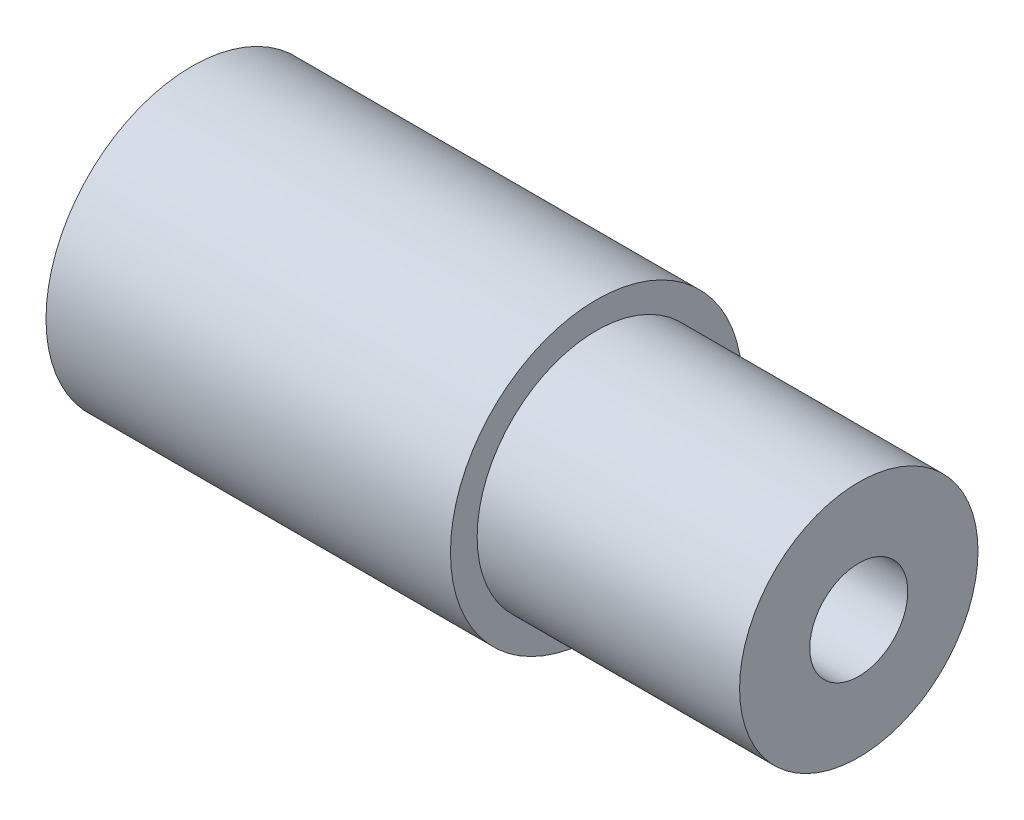
ISO-10303-21;
HEADER;
FILE_DESCRIPTION(('STEP AP214'),'2;1');
FILE_NAME('part.step','',(''),(''),'','','');
FILE_SCHEMA(('AUTOMOTIVE_DESIGN { 1 0 10303 214 1 1 1 1 }'));
ENDSEC;
DATA;
#1=APPLICATION_CONTEXT('core data for automotive mechanical design processes');
#2=APPLICATION_PROTOCOL_DEFINITION('international standard','automotive_design',2000,#1);
#3=PRODUCT_CONTEXT('',#1,'mechanical');
#4=PRODUCT('Part','Part','',(#3));
#5=PRODUCT_RELATED_PRODUCT_CATEGORY('part','',(#4));
#6=PRODUCT_DEFINITION_FORMATION('','',#4);
#7=PRODUCT_DEFINITION_CONTEXT('part definition',#1,'design');
#8=PRODUCT_DEFINITION('design','',#6,#7);
#9=PRODUCT_DEFINITION_SHAPE('','',#8);
#10=(LENGTH_UNIT() NAMED_UNIT(*) SI_UNIT(.MILLI.,.METRE.));
#11=(NAMED_UNIT(*) PLANE_ANGLE_UNIT() SI_UNIT($,.RADIAN.));
#12=(NAMED_UNIT(*) SI_UNIT($,.STERADIAN.) SOLID_ANGLE_UNIT());
#13=UNCERTAINTY_MEASURE_WITH_UNIT(LENGTH_MEASURE(1.E-05),#10,'distance_accuracy_value','');
#14=(GEOMETRIC_REPRESENTATION_CONTEXT(3) GLOBAL_UNCERTAINTY_ASSIGNED_CONTEXT((#13)) GLOBAL_UNIT_ASSIGNED_CONTEXT((#10,
#11,#12)) REPRESENTATION_CONTEXT('',''));
#15=CARTESIAN_POINT('',(0.,0.,0.));
#16=DIRECTION('',(0.,0.,1.));
#17=DIRECTION('',(1.,0.,0.));
#18=AXIS2_PLACEMENT_3D('',#15,#16,#17);
#19=CARTESIAN_POINT('',(-21.6,0.,0.));
#20=DIRECTION('',(1.,0.,0.));
#21=DIRECTION('',(0.,0.,-1.));
#22=AXIS2_PLACEMENT_3D('',#19,#20,#21);
#23=PLANE('',#22);
#24=CARTESIAN_POINT('',(-21.6,0.,0.));
#25=DIRECTION('',(1.,0.,0.));
#26=DIRECTION('',(0.,0.,-1.));
#27=AXIS2_PLACEMENT_3D('',#24,#25,#26);
#28=CIRCLE('',#27,4.7625);
#29=CARTESIAN_POINT('',(-21.6,0.,-4.7625));
#30=VERTEX_POINT('',#29);
#31=EDGE_CURVE('E53',#30,#30,#28,.F.);
#32=ORIENTED_EDGE('',*,*,#31,.F.);
#33=EDGE_LOOP('',(#32));
#34=FACE_BOUND('',#33,.T.);
#35=CARTESIAN_POINT('',(-21.6,0.,0.));
#36=DIRECTION('',(-1.,0.,0.));
#37=DIRECTION('',(0.,0.,1.));
#38=AXIS2_PLACEMENT_3D('',#35,#36,#37);
#39=CIRCLE('',#38,9.45);
#40=CARTESIAN_POINT('',(-21.6,0.,9.45));
#41=VERTEX_POINT('',#40);
#42=EDGE_CURVE('E10',#41,#41,#39,.T.);
#43=ORIENTED_EDGE('',*,*,#42,.T.);
#44=EDGE_LOOP('',(#43));
#45=FACE_BOUND('',#44,.T.);
#46=ADVANCED_FACE('F39',(#34,#45),#23,.F.);
#47=CARTESIAN_POINT('',(-1000.,0.,0.));
#48=DIRECTION('',(-1.,0.,0.));
#49=DIRECTION('',(0.,0.,1.));
#50=AXIS2_PLACEMENT_3D('',#47,#48,#49);
#51=CYLINDRICAL_SURFACE('',#50,9.45);
#52=ORIENTED_EDGE('',*,*,#42,.F.);
#53=EDGE_LOOP('',(#52));
#54=FACE_BOUND('',#53,.T.);
#55=CARTESIAN_POINT('',(4.59999999999994,0.,0.));
#56=DIRECTION('',(-1.,0.,0.));
#57=DIRECTION('',(0.,0.,1.));
#58=AXIS2_PLACEMENT_3D('',#55,#56,#57);
#59=CIRCLE('',#58,9.45);
#60=CARTESIAN_POINT('',(4.59999999999994,0.,9.45));
#61=VERTEX_POINT('',#60);
#62=EDGE_CURVE('E46',#61,#61,#59,.T.);
#63=ORIENTED_EDGE('',*,*,#62,.T.);
#64=EDGE_LOOP('',(#63));
#65=FACE_BOUND('',#64,.T.);
#66=ADVANCED_FACE('F92',(#54,#65),#51,.T.);
#67=CARTESIAN_POINT('',(4.6,9.45,0.));
#68=DIRECTION('',(-1.,0.,0.));
#69=DIRECTION('',(0.,0.,1.));
#70=AXIS2_PLACEMENT_3D('',#67,#68,#69);
#71=PLANE('',#70);
#72=ORIENTED_EDGE('',*,*,#62,.F.);
#73=EDGE_LOOP('',(#72));
#74=FACE_BOUND('',#73,.T.);
#75=CARTESIAN_POINT('',(4.59999999999994,0.,0.));
#76=DIRECTION('',(-1.,0.,0.));
#77=DIRECTION('',(0.,0.,1.));
#78=AXIS2_PLACEMENT_3D('',#75,#76,#77);
#79=CIRCLE('',#78,7.722);
#80=CARTESIAN_POINT('',(4.59999999999994,0.,7.722));
#81=VERTEX_POINT('',#80);
#82=EDGE_CURVE('E51',#81,#81,#79,.T.);
#83=ORIENTED_EDGE('',*,*,#82,.T.);
#84=EDGE_LOOP('',(#83));
#85=FACE_BOUND('',#84,.T.);
#86=ADVANCED_FACE('F75',(#74,#85),#71,.F.);
#87=CARTESIAN_POINT('',(-1000.,0.,0.));
#88=DIRECTION('',(-1.,0.,0.));
#89=DIRECTION('',(0.,0.,1.));
#90=AXIS2_PLACEMENT_3D('',#87,#88,#89);
#91=CYLINDRICAL_SURFACE('',#90,7.722);
#92=ORIENTED_EDGE('',*,*,#82,.F.);
#93=EDGE_LOOP('',(#92));
#94=FACE_BOUND('',#93,.T.);
#95=CARTESIAN_POINT('',(21.6000000000001,0.,0.));
#96=DIRECTION('',(-1.,0.,0.));
#97=DIRECTION('',(0.,0.,1.));
#98=AXIS2_PLACEMENT_3D('',#95,#96,#97);
#99=CIRCLE('',#98,7.722);
#100=CARTESIAN_POINT('',(21.6000000000001,0.,7.722));
#101=VERTEX_POINT('',#100);
#102=EDGE_CURVE('E57',#101,#101,#99,.T.);
#103=ORIENTED_EDGE('',*,*,#102,.T.);
#104=EDGE_LOOP('',(#103));
#105=FACE_BOUND('',#104,.T.);
#106=ADVANCED_FACE('F74',(#94,#105),#91,.T.);
#107=CARTESIAN_POINT('',(21.6,7.722,0.));
#108=DIRECTION('',(-1.,0.,0.));
#109=DIRECTION('',(0.,0.,1.));
#110=AXIS2_PLACEMENT_3D('',#107,#108,#109);
#111=PLANE('',#110);
#112=CARTESIAN_POINT('',(21.6000000000001,0.,0.));
#113=DIRECTION('',(-1.,0.,0.));
#114=DIRECTION('',(0.,0.,1.));
#115=AXIS2_PLACEMENT_3D('',#112,#113,#114);
#116=CIRCLE('',#115,3.175);
#117=CARTESIAN_POINT('',(21.6000000000001,0.,3.175));
#118=VERTEX_POINT('',#117);
#119=EDGE_CURVE('E45',#118,#118,#116,.F.);
#120=ORIENTED_EDGE('',*,*,#119,.F.);
#121=EDGE_LOOP('',(#120));
#122=FACE_BOUND('',#121,.T.);
#123=ORIENTED_EDGE('',*,*,#102,.F.);
#124=EDGE_LOOP('',(#123));
#125=FACE_BOUND('',#124,.T.);
#126=ADVANCED_FACE('F79',(#122,#125),#111,.F.);
#127=CARTESIAN_POINT('',(-1000.,0.,0.));
#128=DIRECTION('',(-1.,0.,0.));
#129=DIRECTION('',(0.,0.,1.));
#130=AXIS2_PLACEMENT_3D('',#127,#128,#129);
#131=CYLINDRICAL_SURFACE('',#130,4.7625);
#132=CARTESIAN_POINT('',(-4.80000000000003,0.,0.));
#133=DIRECTION('',(-1.,0.,0.));
#134=DIRECTION('',(0.,0.,1.));
#135=AXIS2_PLACEMENT_3D('',#132,#133,#134);
#136=CIRCLE('',#135,4.7625);
#137=CARTESIAN_POINT('',(-4.80000000000003,0.,4.7625));
#138=VERTEX_POINT('',#137);
#139=EDGE_CURVE('E60',#138,#138,#136,.T.);
#140=ORIENTED_EDGE('',*,*,#139,.F.);
#141=EDGE_LOOP('',(#140));
#142=FACE_BOUND('',#141,.T.);
#143=ORIENTED_EDGE('',*,*,#31,.T.);
#144=EDGE_LOOP('',(#143));
#145=FACE_BOUND('',#144,.T.);
#146=ADVANCED_FACE('F85',(#142,#145),#131,.F.);
#147=CARTESIAN_POINT('',(-4.8,4.7625,0.));
#148=DIRECTION('',(-1.,0.,0.));
#149=DIRECTION('',(0.,0.,1.));
#150=AXIS2_PLACEMENT_3D('',#147,#148,#149);
#151=PLANE('',#150);
#152=ORIENTED_EDGE('',*,*,#139,.T.);
#153=EDGE_LOOP('',(#152));
#154=FACE_BOUND('',#153,.T.);
#155=ADVANCED_FACE('F89',(#154),#151,.T.);
#156=CARTESIAN_POINT('',(-1000.,0.,0.));
#157=DIRECTION('',(-1.,0.,0.));
#158=DIRECTION('',(0.,0.,1.));
#159=AXIS2_PLACEMENT_3D('',#156,#157,#158);
#160=CYLINDRICAL_SURFACE('',#159,3.175);
#161=CARTESIAN_POINT('',(6.39999999999996,0.,0.));
#162=DIRECTION('',(-1.,0.,0.));
#163=DIRECTION('',(0.,0.,1.));
#164=AXIS2_PLACEMENT_3D('',#161,#162,#163);
#165=CIRCLE('',#164,3.175);
#166=CARTESIAN_POINT('',(6.39999999999996,0.,3.175));
#167=VERTEX_POINT('',#166);
#168=EDGE_CURVE('E70',#167,#167,#165,.T.);
#169=ORIENTED_EDGE('',*,*,#168,.T.);
#170=EDGE_LOOP('',(#169));
#171=FACE_BOUND('',#170,.T.);
#172=ORIENTED_EDGE('',*,*,#119,.T.);
#173=EDGE_LOOP('',(#172));
#174=FACE_BOUND('',#173,.T.);
#175=ADVANCED_FACE('F135',(#171,#174),#160,.F.);
#176=CARTESIAN_POINT('',(6.4,0.,0.));
#177=DIRECTION('',(1.,0.,0.));
#178=DIRECTION('',(0.,0.,-1.));
#179=AXIS2_PLACEMENT_3D('',#176,#177,#178);
#180=PLANE('',#179);
#181=ORIENTED_EDGE('',*,*,#168,.F.);
#182=EDGE_LOOP('',(#181));
#183=FACE_BOUND('',#182,.T.);
#184=ADVANCED_FACE('F142',(#183),#180,.T.);
#185=CLOSED_SHELL('',(#46,#66,#86,#106,#126,#146,#155,#175,#184));
#186=MANIFOLD_SOLID_BREP('B2',#185);
#187=ADVANCED_BREP_SHAPE_REPRESENTATION('',(#18,#186),#14);
#188=SHAPE_DEFINITION_REPRESENTATION(#9,#187);
ENDSEC;
END-ISO-10303-21;
